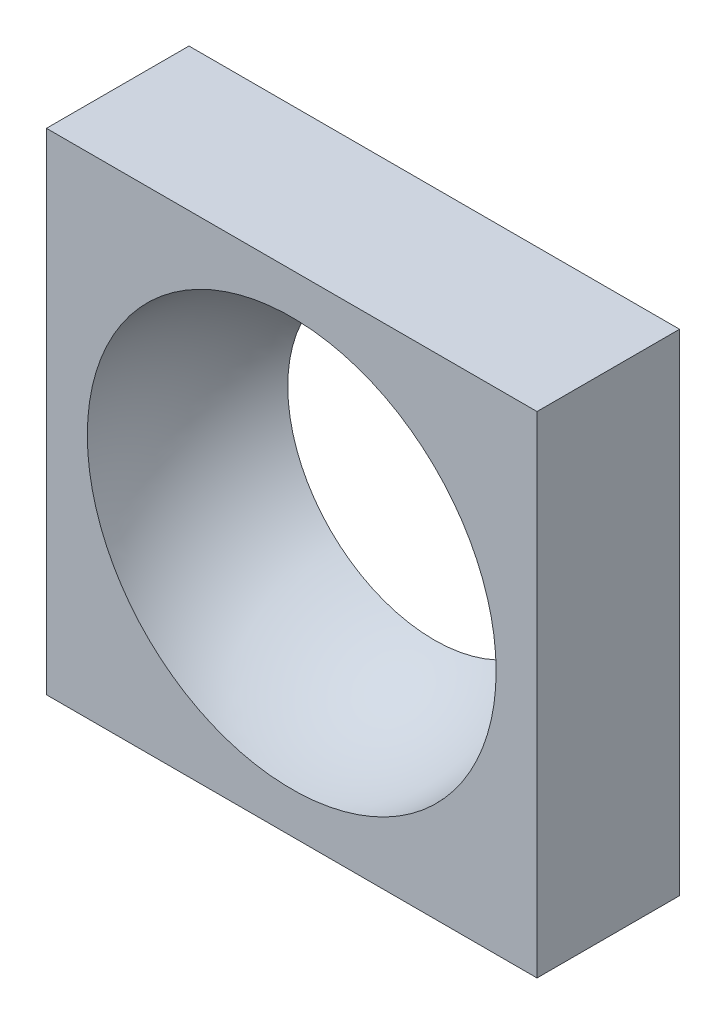
ISO-10303-21;
HEADER;
FILE_DESCRIPTION(('STEP AP214'),'2;1');
FILE_NAME('part.step','',(''),(''),'','','');
FILE_SCHEMA(('AUTOMOTIVE_DESIGN { 1 0 10303 214 1 1 1 1 }'));
ENDSEC;
DATA;
#1=APPLICATION_CONTEXT('core data for automotive mechanical design processes');
#2=APPLICATION_PROTOCOL_DEFINITION('international standard','automotive_design',2000,#1);
#3=PRODUCT_CONTEXT('',#1,'mechanical');
#4=PRODUCT('Part','Part','',(#3));
#5=PRODUCT_RELATED_PRODUCT_CATEGORY('part','',(#4));
#6=PRODUCT_DEFINITION_FORMATION('','',#4);
#7=PRODUCT_DEFINITION_CONTEXT('part definition',#1,'design');
#8=PRODUCT_DEFINITION('design','',#6,#7);
#9=PRODUCT_DEFINITION_SHAPE('','',#8);
#10=(LENGTH_UNIT() NAMED_UNIT(*) SI_UNIT(.MILLI.,.METRE.));
#11=(NAMED_UNIT(*) PLANE_ANGLE_UNIT() SI_UNIT($,.RADIAN.));
#12=(NAMED_UNIT(*) SI_UNIT($,.STERADIAN.) SOLID_ANGLE_UNIT());
#13=UNCERTAINTY_MEASURE_WITH_UNIT(LENGTH_MEASURE(1.E-05),#10,'distance_accuracy_value','');
#14=(GEOMETRIC_REPRESENTATION_CONTEXT(3) GLOBAL_UNCERTAINTY_ASSIGNED_CONTEXT((#13)) GLOBAL_UNIT_ASSIGNED_CONTEXT((#10,
#11,#12)) REPRESENTATION_CONTEXT('',''));
#15=CARTESIAN_POINT('',(0.,0.,0.));
#16=DIRECTION('',(0.,0.,1.));
#17=DIRECTION('',(1.,0.,0.));
#18=AXIS2_PLACEMENT_3D('',#15,#16,#17);
#19=CARTESIAN_POINT('',(0.,0.,12.));
#20=DIRECTION('',(1.,0.,0.));
#21=DIRECTION('',(0.,0.,-1.));
#22=AXIS2_PLACEMENT_3D('',#19,#20,#21);
#23=PLANE('',#22);
#24=DIRECTION('',(0.,0.,-1.));
#25=VECTOR('',#24,1.);
#26=CARTESIAN_POINT('',(0.,24.,12.));
#27=LINE('',#26,#25);
#28=CARTESIAN_POINT('',(0.,24.,12.));
#29=VERTEX_POINT('',#28);
#30=CARTESIAN_POINT('',(0.,24.,5.02661661329301));
#31=VERTEX_POINT('',#30);
#32=EDGE_CURVE('E87',#29,#31,#27,.T.);
#33=ORIENTED_EDGE('',*,*,#32,.T.);
#34=DIRECTION('',(0.,-1.,0.));
#35=VECTOR('',#34,1.);
#36=CARTESIAN_POINT('',(0.,24.,5.02661661329301));
#37=LINE('',#36,#35);
#38=CARTESIAN_POINT('',(0.,0.,5.02661661329301));
#39=VERTEX_POINT('',#38);
#40=EDGE_CURVE('E48',#31,#39,#37,.T.);
#41=ORIENTED_EDGE('',*,*,#40,.T.);
#42=DIRECTION('',(0.,0.,-1.));
#43=VECTOR('',#42,1.);
#44=CARTESIAN_POINT('',(0.,0.,12.));
#45=LINE('',#44,#43);
#46=CARTESIAN_POINT('',(0.,0.,12.));
#47=VERTEX_POINT('',#46);
#48=EDGE_CURVE('E11',#47,#39,#45,.T.);
#49=ORIENTED_EDGE('',*,*,#48,.F.);
#50=DIRECTION('',(0.,-1.,0.));
#51=VECTOR('',#50,1.);
#52=CARTESIAN_POINT('',(0.,0.,12.));
#53=LINE('',#52,#51);
#54=EDGE_CURVE('E93',#29,#47,#53,.T.);
#55=ORIENTED_EDGE('',*,*,#54,.F.);
#56=EDGE_LOOP('',(#33,#41,#49,#55));
#57=FACE_BOUND('',#56,.T.);
#58=ADVANCED_FACE('F32',(#57),#23,.F.);
#59=CARTESIAN_POINT('',(0.,0.,12.));
#60=DIRECTION('',(0.,1.,0.));
#61=DIRECTION('',(0.,0.,1.));
#62=AXIS2_PLACEMENT_3D('',#59,#60,#61);
#63=PLANE('',#62);
#64=ORIENTED_EDGE('',*,*,#48,.T.);
#65=DIRECTION('',(1.,0.,0.));
#66=VECTOR('',#65,1.);
#67=CARTESIAN_POINT('',(0.,0.,5.02661661329301));
#68=LINE('',#67,#66);
#69=CARTESIAN_POINT('',(24.,0.,5.02661661329301));
#70=VERTEX_POINT('',#69);
#71=EDGE_CURVE('E73',#39,#70,#68,.T.);
#72=ORIENTED_EDGE('',*,*,#71,.T.);
#73=DIRECTION('',(0.,0.,-1.));
#74=VECTOR('',#73,1.);
#75=CARTESIAN_POINT('',(24.,0.,12.));
#76=LINE('',#75,#74);
#77=CARTESIAN_POINT('',(24.,0.,12.));
#78=VERTEX_POINT('',#77);
#79=EDGE_CURVE('E40',#78,#70,#76,.T.);
#80=ORIENTED_EDGE('',*,*,#79,.F.);
#81=DIRECTION('',(1.,0.,0.));
#82=VECTOR('',#81,1.);
#83=CARTESIAN_POINT('',(0.,0.,12.));
#84=LINE('',#83,#82);
#85=EDGE_CURVE('E90',#47,#78,#84,.T.);
#86=ORIENTED_EDGE('',*,*,#85,.F.);
#87=EDGE_LOOP('',(#64,#72,#80,#86));
#88=FACE_BOUND('',#87,.T.);
#89=ADVANCED_FACE('F89',(#88),#63,.F.);
#90=CARTESIAN_POINT('',(24.,0.,12.));
#91=DIRECTION('',(-1.,0.,0.));
#92=DIRECTION('',(0.,0.,1.));
#93=AXIS2_PLACEMENT_3D('',#90,#91,#92);
#94=PLANE('',#93);
#95=ORIENTED_EDGE('',*,*,#79,.T.);
#96=DIRECTION('',(0.,-1.,0.));
#97=VECTOR('',#96,1.);
#98=CARTESIAN_POINT('',(24.,24.,5.02661661329301));
#99=LINE('',#98,#97);
#100=CARTESIAN_POINT('',(24.,24.,5.02661661329301));
#101=VERTEX_POINT('',#100);
#102=EDGE_CURVE('E77',#101,#70,#99,.T.);
#103=ORIENTED_EDGE('',*,*,#102,.F.);
#104=DIRECTION('',(0.,0.,-1.));
#105=VECTOR('',#104,1.);
#106=CARTESIAN_POINT('',(24.,24.,12.));
#107=LINE('',#106,#105);
#108=CARTESIAN_POINT('',(24.,24.,12.));
#109=VERTEX_POINT('',#108);
#110=EDGE_CURVE('E104',#109,#101,#107,.T.);
#111=ORIENTED_EDGE('',*,*,#110,.F.);
#112=DIRECTION('',(0.,1.,0.));
#113=VECTOR('',#112,1.);
#114=CARTESIAN_POINT('',(24.,0.,12.));
#115=LINE('',#114,#113);
#116=EDGE_CURVE('E92',#78,#109,#115,.T.);
#117=ORIENTED_EDGE('',*,*,#116,.F.);
#118=EDGE_LOOP('',(#95,#103,#111,#117));
#119=FACE_BOUND('',#118,.T.);
#120=ADVANCED_FACE('F108',(#119),#94,.F.);
#121=CARTESIAN_POINT('',(0.,24.,12.));
#122=DIRECTION('',(0.,-1.,0.));
#123=DIRECTION('',(0.,0.,-1.));
#124=AXIS2_PLACEMENT_3D('',#121,#122,#123);
#125=PLANE('',#124);
#126=ORIENTED_EDGE('',*,*,#110,.T.);
#127=DIRECTION('',(1.,0.,0.));
#128=VECTOR('',#127,1.);
#129=CARTESIAN_POINT('',(0.,24.,5.02661661329301));
#130=LINE('',#129,#128);
#131=EDGE_CURVE('E81',#31,#101,#130,.T.);
#132=ORIENTED_EDGE('',*,*,#131,.F.);
#133=ORIENTED_EDGE('',*,*,#32,.F.);
#134=DIRECTION('',(-1.,0.,0.));
#135=VECTOR('',#134,1.);
#136=CARTESIAN_POINT('',(0.,24.,12.));
#137=LINE('',#136,#135);
#138=EDGE_CURVE('E56',#109,#29,#137,.T.);
#139=ORIENTED_EDGE('',*,*,#138,.F.);
#140=EDGE_LOOP('',(#126,#132,#133,#139));
#141=FACE_BOUND('',#140,.T.);
#142=ADVANCED_FACE('F111',(#141),#125,.F.);
#143=CARTESIAN_POINT('',(0.,0.,12.));
#144=DIRECTION('',(0.,0.,-1.));
#145=DIRECTION('',(-1.,0.,0.));
#146=AXIS2_PLACEMENT_3D('',#143,#144,#145);
#147=PLANE('',#146);
#148=CARTESIAN_POINT('',(12.,12.,12.));
#149=DIRECTION('',(0.,0.,-1.));
#150=DIRECTION('',(-1.,0.,0.));
#151=AXIS2_PLACEMENT_3D('',#148,#149,#150);
#152=CIRCLE('',#151,10.);
#153=CARTESIAN_POINT('',(2.,12.,12.));
#154=VERTEX_POINT('',#153);
#155=EDGE_CURVE('E96',#154,#154,#152,.T.);
#156=ORIENTED_EDGE('',*,*,#155,.T.);
#157=EDGE_LOOP('',(#156));
#158=FACE_BOUND('',#157,.T.);
#159=ORIENTED_EDGE('',*,*,#54,.T.);
#160=ORIENTED_EDGE('',*,*,#85,.T.);
#161=ORIENTED_EDGE('',*,*,#116,.T.);
#162=ORIENTED_EDGE('',*,*,#138,.T.);
#163=EDGE_LOOP('',(#159,#160,#161,#162));
#164=FACE_BOUND('',#163,.T.);
#165=ADVANCED_FACE('F95',(#158,#164),#147,.F.);
#166=CARTESIAN_POINT('',(12.,12.,12.));
#167=DIRECTION('',(0.,1.,0.));
#168=DIRECTION('',(1.,0.,0.));
#169=AXIS2_PLACEMENT_3D('',#166,#167,#168);
#170=SPHERICAL_SURFACE('',#169,10.);
#171=CARTESIAN_POINT('',(12.,12.,12.));
#172=DIRECTION('',(0.,0.,1.));
#173=DIRECTION('',(1.,0.,0.));
#174=AXIS2_PLACEMENT_3D('',#171,#172,#173);
#175=SPHERICAL_SURFACE('',#174,10.);
#176=CARTESIAN_POINT('',(12.,12.,5.02661661329301));
#177=DIRECTION('',(0.,0.,1.));
#178=DIRECTION('',(1.,0.,0.));
#179=AXIS2_PLACEMENT_3D('',#176,#177,#178);
#180=CIRCLE('',#179,7.16742102446891);
#181=CARTESIAN_POINT('',(19.1674210244689,12.,5.02661661329301));
#182=VERTEX_POINT('',#181);
#183=EDGE_CURVE('E35',#182,#182,#180,.F.);
#184=ORIENTED_EDGE('',*,*,#183,.T.);
#185=EDGE_LOOP('',(#184));
#186=FACE_BOUND('',#185,.T.);
#187=ORIENTED_EDGE('',*,*,#155,.F.);
#188=EDGE_LOOP('',(#187));
#189=FACE_BOUND('',#188,.T.);
#190=ADVANCED_FACE('F119',(#186,#189),#175,.F.);
#191=CARTESIAN_POINT('',(0.,24.,5.02661661329301));
#192=DIRECTION('',(0.,0.,1.));
#193=DIRECTION('',(1.,0.,0.));
#194=AXIS2_PLACEMENT_3D('',#191,#192,#193);
#195=PLANE('',#194);
#196=ORIENTED_EDGE('',*,*,#102,.T.);
#197=ORIENTED_EDGE('',*,*,#71,.F.);
#198=ORIENTED_EDGE('',*,*,#40,.F.);
#199=ORIENTED_EDGE('',*,*,#131,.T.);
#200=EDGE_LOOP('',(#196,#197,#198,#199));
#201=FACE_BOUND('',#200,.T.);
#202=ORIENTED_EDGE('',*,*,#183,.F.);
#203=EDGE_LOOP('',(#202));
#204=FACE_BOUND('',#203,.T.);
#205=ADVANCED_FACE('F74',(#201,#204),#195,.F.);
#206=CLOSED_SHELL('',(#58,#89,#120,#142,#165,#190,#205));
#207=MANIFOLD_SOLID_BREP('B2',#206);
#208=ADVANCED_BREP_SHAPE_REPRESENTATION('',(#18,#207),#14);
#209=SHAPE_DEFINITION_REPRESENTATION(#9,#208);
ENDSEC;
END-ISO-10303-21;
